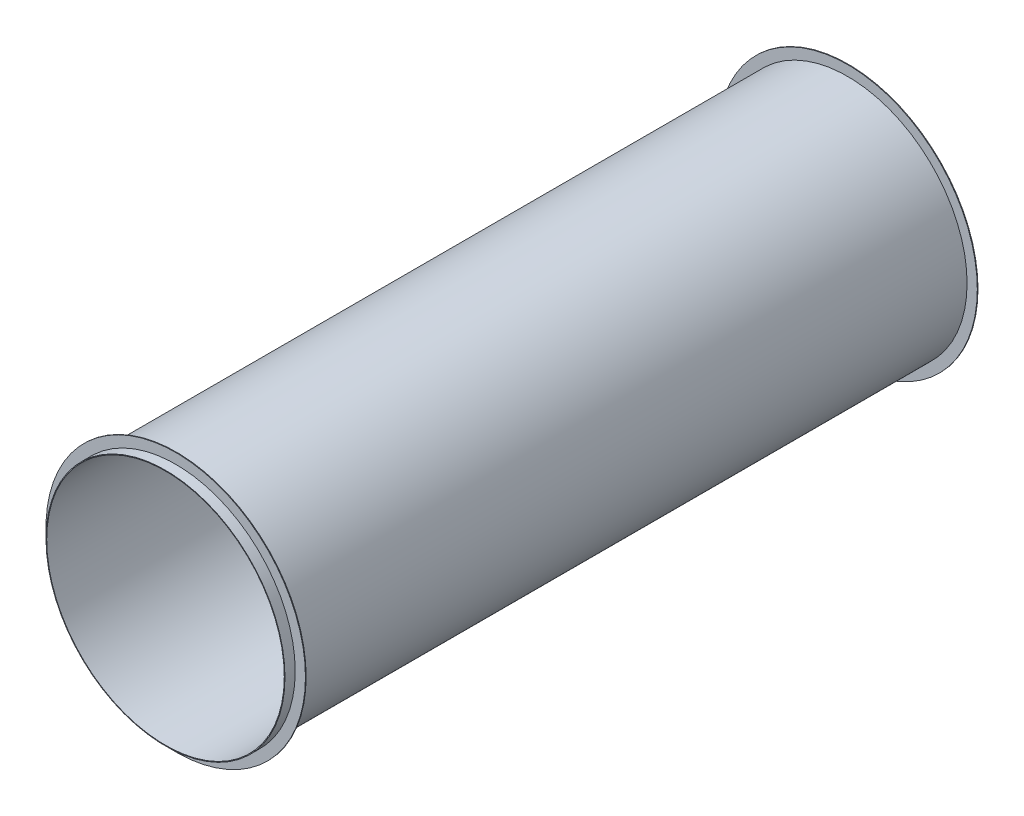
ISO-10303-21;
HEADER;
FILE_DESCRIPTION(('STEP AP214'),'2;1');
FILE_NAME('part.step','',(''),(''),'','','');
FILE_SCHEMA(('AUTOMOTIVE_DESIGN { 1 0 10303 214 1 1 1 1 }'));
ENDSEC;
DATA;
#1=APPLICATION_CONTEXT('core data for automotive mechanical design processes');
#2=APPLICATION_PROTOCOL_DEFINITION('international standard','automotive_design',2000,#1);
#3=PRODUCT_CONTEXT('',#1,'mechanical');
#4=PRODUCT('Part','Part','',(#3));
#5=PRODUCT_RELATED_PRODUCT_CATEGORY('part','',(#4));
#6=PRODUCT_DEFINITION_FORMATION('','',#4);
#7=PRODUCT_DEFINITION_CONTEXT('part definition',#1,'design');
#8=PRODUCT_DEFINITION('design','',#6,#7);
#9=PRODUCT_DEFINITION_SHAPE('','',#8);
#10=(LENGTH_UNIT() NAMED_UNIT(*) SI_UNIT(.MILLI.,.METRE.));
#11=(NAMED_UNIT(*) PLANE_ANGLE_UNIT() SI_UNIT($,.RADIAN.));
#12=(NAMED_UNIT(*) SI_UNIT($,.STERADIAN.) SOLID_ANGLE_UNIT());
#13=UNCERTAINTY_MEASURE_WITH_UNIT(LENGTH_MEASURE(1.E-05),#10,'distance_accuracy_value','');
#14=(GEOMETRIC_REPRESENTATION_CONTEXT(3) GLOBAL_UNCERTAINTY_ASSIGNED_CONTEXT((#13)) GLOBAL_UNIT_ASSIGNED_CONTEXT((#10,
#11,#12)) REPRESENTATION_CONTEXT('',''));
#15=CARTESIAN_POINT('',(0.,0.,0.));
#16=DIRECTION('',(0.,0.,1.));
#17=DIRECTION('',(1.,0.,0.));
#18=AXIS2_PLACEMENT_3D('',#15,#16,#17);
#19=CARTESIAN_POINT('',(0.,0.,45500.));
#20=DIRECTION('',(0.,0.,1.));
#21=DIRECTION('',(1.,0.,0.));
#22=AXIS2_PLACEMENT_3D('',#19,#20,#21);
#23=CYLINDRICAL_SURFACE('',#22,3480.00000000003);
#24=CARTESIAN_POINT('',(0.,0.,35000.));
#25=DIRECTION('',(0.,0.,1.));
#26=DIRECTION('',(1.,0.,0.));
#27=AXIS2_PLACEMENT_3D('',#24,#25,#26);
#28=CIRCLE('',#27,3480.00000000003);
#29=CARTESIAN_POINT('',(3480.00000000003,0.,35000.));
#30=VERTEX_POINT('',#29);
#31=EDGE_CURVE('E69',#30,#30,#28,.T.);
#32=ORIENTED_EDGE('',*,*,#31,.T.);
#33=EDGE_LOOP('',(#32));
#34=FACE_BOUND('',#33,.T.);
#35=CARTESIAN_POINT('',(0.,0.,15000.));
#36=DIRECTION('',(0.,0.,1.));
#37=DIRECTION('',(1.,0.,0.));
#38=AXIS2_PLACEMENT_3D('',#35,#36,#37);
#39=CIRCLE('',#38,3480.00000000003);
#40=CARTESIAN_POINT('',(3480.00000000003,0.,15000.));
#41=VERTEX_POINT('',#40);
#42=EDGE_CURVE('E10',#41,#41,#39,.T.);
#43=ORIENTED_EDGE('',*,*,#42,.F.);
#44=EDGE_LOOP('',(#43));
#45=FACE_BOUND('',#44,.T.);
#46=ADVANCED_FACE('F35',(#34,#45),#23,.F.);
#47=CARTESIAN_POINT('',(0.,0.,15000.));
#48=DIRECTION('',(0.,0.,1.));
#49=DIRECTION('',(1.,0.,0.));
#50=AXIS2_PLACEMENT_3D('',#47,#48,#49);
#51=PLANE('',#50);
#52=CARTESIAN_POINT('',(0.,0.,15000.));
#53=DIRECTION('',(0.,0.,1.));
#54=DIRECTION('',(1.,0.,0.));
#55=AXIS2_PLACEMENT_3D('',#52,#53,#54);
#56=CIRCLE('',#55,3800.00000000003);
#57=CARTESIAN_POINT('',(3800.00000000003,0.,15000.));
#58=VERTEX_POINT('',#57);
#59=EDGE_CURVE('E41',#58,#58,#56,.T.);
#60=ORIENTED_EDGE('',*,*,#59,.F.);
#61=EDGE_LOOP('',(#60));
#62=FACE_BOUND('',#61,.T.);
#63=ORIENTED_EDGE('',*,*,#42,.T.);
#64=EDGE_LOOP('',(#63));
#65=FACE_BOUND('',#64,.T.);
#66=ADVANCED_FACE('F88',(#62,#65),#51,.F.);
#67=CARTESIAN_POINT('',(0.,0.,45500.));
#68=DIRECTION('',(0.,0.,1.));
#69=DIRECTION('',(1.,0.,0.));
#70=AXIS2_PLACEMENT_3D('',#67,#68,#69);
#71=CYLINDRICAL_SURFACE('',#70,3800.00000000003);
#72=CARTESIAN_POINT('',(0.,0.,15020.));
#73=DIRECTION('',(0.,0.,1.));
#74=DIRECTION('',(1.,0.,0.));
#75=AXIS2_PLACEMENT_3D('',#72,#73,#74);
#76=CIRCLE('',#75,3800.00000000003);
#77=CARTESIAN_POINT('',(3800.00000000003,0.,15020.));
#78=VERTEX_POINT('',#77);
#79=EDGE_CURVE('E45',#78,#78,#76,.T.);
#80=ORIENTED_EDGE('',*,*,#79,.F.);
#81=EDGE_LOOP('',(#80));
#82=FACE_BOUND('',#81,.T.);
#83=ORIENTED_EDGE('',*,*,#59,.T.);
#84=EDGE_LOOP('',(#83));
#85=FACE_BOUND('',#84,.T.);
#86=ADVANCED_FACE('F92',(#82,#85),#71,.T.);
#87=CARTESIAN_POINT('',(0.,0.,15020.));
#88=DIRECTION('',(0.,0.,1.));
#89=DIRECTION('',(1.,0.,0.));
#90=AXIS2_PLACEMENT_3D('',#87,#88,#89);
#91=PLANE('',#90);
#92=ORIENTED_EDGE('',*,*,#79,.T.);
#93=EDGE_LOOP('',(#92));
#94=FACE_BOUND('',#93,.T.);
#95=CARTESIAN_POINT('',(0.,0.,15020.));
#96=DIRECTION('',(0.,0.,1.));
#97=DIRECTION('',(1.,0.,0.));
#98=AXIS2_PLACEMENT_3D('',#95,#96,#97);
#99=CIRCLE('',#98,3500.);
#100=CARTESIAN_POINT('',(3500.,0.,15020.));
#101=VERTEX_POINT('',#100);
#102=EDGE_CURVE('E49',#101,#101,#99,.T.);
#103=ORIENTED_EDGE('',*,*,#102,.F.);
#104=EDGE_LOOP('',(#103));
#105=FACE_BOUND('',#104,.T.);
#106=ADVANCED_FACE('F97',(#94,#105),#91,.T.);
#107=CARTESIAN_POINT('',(0.,0.,45500.));
#108=DIRECTION('',(0.,0.,1.));
#109=DIRECTION('',(1.,0.,0.));
#110=AXIS2_PLACEMENT_3D('',#107,#108,#109);
#111=CYLINDRICAL_SURFACE('',#110,3500.00000000003);
#112=ORIENTED_EDGE('',*,*,#102,.T.);
#113=EDGE_LOOP('',(#112));
#114=FACE_BOUND('',#113,.T.);
#115=CARTESIAN_POINT('',(0.,0.,34680.));
#116=DIRECTION('',(0.,0.,1.));
#117=DIRECTION('',(1.,0.,0.));
#118=AXIS2_PLACEMENT_3D('',#115,#116,#117);
#119=CIRCLE('',#118,3500.00000000003);
#120=CARTESIAN_POINT('',(3500.00000000003,0.,34680.));
#121=VERTEX_POINT('',#120);
#122=EDGE_CURVE('E54',#121,#121,#119,.T.);
#123=ORIENTED_EDGE('',*,*,#122,.F.);
#124=EDGE_LOOP('',(#123));
#125=FACE_BOUND('',#124,.T.);
#126=ADVANCED_FACE('F86',(#114,#125),#111,.T.);
#127=CARTESIAN_POINT('',(0.,-2.33058017329312E-10,34680.));
#128=DIRECTION('',(0.,0.,1.));
#129=DIRECTION('',(1.,0.,0.));
#130=AXIS2_PLACEMENT_3D('',#127,#128,#129);
#131=PLANE('',#130);
#132=CARTESIAN_POINT('',(0.,0.,34680.));
#133=DIRECTION('',(0.,0.,1.));
#134=DIRECTION('',(1.,0.,0.));
#135=AXIS2_PLACEMENT_3D('',#132,#133,#134);
#136=CIRCLE('',#135,3800.00000000003);
#137=CARTESIAN_POINT('',(3800.00000000003,0.,34680.));
#138=VERTEX_POINT('',#137);
#139=EDGE_CURVE('E57',#138,#138,#136,.T.);
#140=ORIENTED_EDGE('',*,*,#139,.F.);
#141=EDGE_LOOP('',(#140));
#142=FACE_BOUND('',#141,.T.);
#143=ORIENTED_EDGE('',*,*,#122,.T.);
#144=EDGE_LOOP('',(#143));
#145=FACE_BOUND('',#144,.T.);
#146=ADVANCED_FACE('F104',(#142,#145),#131,.F.);
#147=CARTESIAN_POINT('',(0.,0.,45500.));
#148=DIRECTION('',(0.,0.,1.));
#149=DIRECTION('',(1.,0.,0.));
#150=AXIS2_PLACEMENT_3D('',#147,#148,#149);
#151=CYLINDRICAL_SURFACE('',#150,3800.00000000003);
#152=CARTESIAN_POINT('',(0.,0.,34700.));
#153=DIRECTION('',(0.,0.,1.));
#154=DIRECTION('',(1.,0.,0.));
#155=AXIS2_PLACEMENT_3D('',#152,#153,#154);
#156=CIRCLE('',#155,3800.00000000003);
#157=CARTESIAN_POINT('',(3800.00000000003,0.,34700.));
#158=VERTEX_POINT('',#157);
#159=EDGE_CURVE('E60',#158,#158,#156,.T.);
#160=ORIENTED_EDGE('',*,*,#159,.F.);
#161=EDGE_LOOP('',(#160));
#162=FACE_BOUND('',#161,.T.);
#163=ORIENTED_EDGE('',*,*,#139,.T.);
#164=EDGE_LOOP('',(#163));
#165=FACE_BOUND('',#164,.T.);
#166=ADVANCED_FACE('F107',(#162,#165),#151,.T.);
#167=CARTESIAN_POINT('',(0.,0.,34700.));
#168=DIRECTION('',(0.,0.,1.));
#169=DIRECTION('',(1.,0.,0.));
#170=AXIS2_PLACEMENT_3D('',#167,#168,#169);
#171=PLANE('',#170);
#172=ORIENTED_EDGE('',*,*,#159,.T.);
#173=EDGE_LOOP('',(#172));
#174=FACE_BOUND('',#173,.T.);
#175=CARTESIAN_POINT('',(0.,0.,34700.));
#176=DIRECTION('',(0.,0.,1.));
#177=DIRECTION('',(1.,0.,0.));
#178=AXIS2_PLACEMENT_3D('',#175,#176,#177);
#179=CIRCLE('',#178,3500.00000000003);
#180=CARTESIAN_POINT('',(3500.00000000003,0.,34700.));
#181=VERTEX_POINT('',#180);
#182=EDGE_CURVE('E63',#181,#181,#179,.T.);
#183=ORIENTED_EDGE('',*,*,#182,.F.);
#184=EDGE_LOOP('',(#183));
#185=FACE_BOUND('',#184,.T.);
#186=ADVANCED_FACE('F83',(#174,#185),#171,.T.);
#187=ORIENTED_EDGE('',*,*,#182,.T.);
#188=EDGE_LOOP('',(#187));
#189=FACE_BOUND('',#188,.T.);
#190=CARTESIAN_POINT('',(0.,0.,35000.));
#191=DIRECTION('',(0.,0.,1.));
#192=DIRECTION('',(1.,0.,0.));
#193=AXIS2_PLACEMENT_3D('',#190,#191,#192);
#194=CIRCLE('',#193,3500.00000000003);
#195=CARTESIAN_POINT('',(3500.00000000003,0.,35000.));
#196=VERTEX_POINT('',#195);
#197=EDGE_CURVE('E66',#196,#196,#194,.T.);
#198=ORIENTED_EDGE('',*,*,#197,.F.);
#199=EDGE_LOOP('',(#198));
#200=FACE_BOUND('',#199,.T.);
#201=ADVANCED_FACE('F77',(#189,#200),#111,.T.);
#202=CARTESIAN_POINT('',(0.,-3.55271367880047E-09,35000.));
#203=DIRECTION('',(0.,0.,1.));
#204=DIRECTION('',(1.,0.,0.));
#205=AXIS2_PLACEMENT_3D('',#202,#203,#204);
#206=PLANE('',#205);
#207=ORIENTED_EDGE('',*,*,#197,.T.);
#208=EDGE_LOOP('',(#207));
#209=FACE_BOUND('',#208,.T.);
#210=ORIENTED_EDGE('',*,*,#31,.F.);
#211=EDGE_LOOP('',(#210));
#212=FACE_BOUND('',#211,.T.);
#213=ADVANCED_FACE('F75',(#209,#212),#206,.T.);
#214=CLOSED_SHELL('',(#46,#66,#86,#106,#126,#146,#166,#186,#201,#213));
#215=MANIFOLD_SOLID_BREP('B2',#214);
#216=ADVANCED_BREP_SHAPE_REPRESENTATION('',(#18,#215),#14);
#217=SHAPE_DEFINITION_REPRESENTATION(#9,#216);
ENDSEC;
END-ISO-10303-21;
